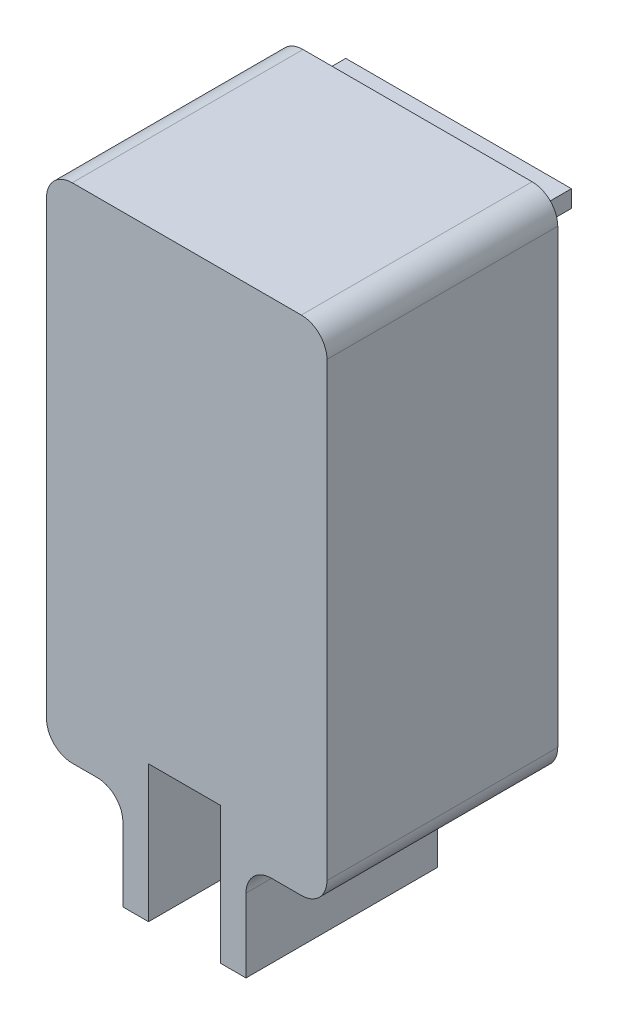
ISO-10303-21;
HEADER;
FILE_DESCRIPTION(('STEP AP214'),'2;1');
FILE_NAME('part.step','',(''),(''),'','','');
FILE_SCHEMA(('AUTOMOTIVE_DESIGN { 1 0 10303 214 1 1 1 1 }'));
ENDSEC;
DATA;
#1=APPLICATION_CONTEXT('core data for automotive mechanical design processes');
#2=APPLICATION_PROTOCOL_DEFINITION('international standard','automotive_design',2000,#1);
#3=PRODUCT_CONTEXT('',#1,'mechanical');
#4=PRODUCT('Part','Part','',(#3));
#5=PRODUCT_RELATED_PRODUCT_CATEGORY('part','',(#4));
#6=PRODUCT_DEFINITION_FORMATION('','',#4);
#7=PRODUCT_DEFINITION_CONTEXT('part definition',#1,'design');
#8=PRODUCT_DEFINITION('design','',#6,#7);
#9=PRODUCT_DEFINITION_SHAPE('','',#8);
#10=(LENGTH_UNIT() NAMED_UNIT(*) SI_UNIT(.MILLI.,.METRE.));
#11=(NAMED_UNIT(*) PLANE_ANGLE_UNIT() SI_UNIT($,.RADIAN.));
#12=(NAMED_UNIT(*) SI_UNIT($,.STERADIAN.) SOLID_ANGLE_UNIT());
#13=UNCERTAINTY_MEASURE_WITH_UNIT(LENGTH_MEASURE(1.E-05),#10,'distance_accuracy_value','');
#14=(GEOMETRIC_REPRESENTATION_CONTEXT(3) GLOBAL_UNCERTAINTY_ASSIGNED_CONTEXT((#13)) GLOBAL_UNIT_ASSIGNED_CONTEXT((#10,
#11,#12)) REPRESENTATION_CONTEXT('',''));
#15=CARTESIAN_POINT('',(0.,0.,0.));
#16=DIRECTION('',(0.,0.,1.));
#17=DIRECTION('',(1.,0.,0.));
#18=AXIS2_PLACEMENT_3D('',#15,#16,#17);
#19=CARTESIAN_POINT('',(7.2,0.,14.));
#20=DIRECTION('',(1.,0.,0.));
#21=DIRECTION('',(0.,0.,-1.));
#22=AXIS2_PLACEMENT_3D('',#19,#20,#21);
#23=PLANE('',#22);
#24=DIRECTION('',(0.,0.,-1.));
#25=VECTOR('',#24,1.);
#26=CARTESIAN_POINT('',(7.2,13.5,14.));
#27=LINE('',#26,#25);
#28=CARTESIAN_POINT('',(7.2,13.5,2.));
#29=VERTEX_POINT('',#28);
#30=CARTESIAN_POINT('',(7.2,13.5,0.));
#31=VERTEX_POINT('',#30);
#32=EDGE_CURVE('E265',#29,#31,#27,.T.);
#33=ORIENTED_EDGE('',*,*,#32,.F.);
#34=DIRECTION('',(0.,-1.,0.));
#35=VECTOR('',#34,1.);
#36=CARTESIAN_POINT('',(7.2,0.,2.));
#37=LINE('',#36,#35);
#38=CARTESIAN_POINT('',(7.2,12.5,2.));
#39=VERTEX_POINT('',#38);
#40=EDGE_CURVE('E247',#29,#39,#37,.T.);
#41=ORIENTED_EDGE('',*,*,#40,.T.);
#42=DIRECTION('',(0.,0.,-1.));
#43=VECTOR('',#42,1.);
#44=CARTESIAN_POINT('',(7.2,12.5,14.));
#45=LINE('',#44,#43);
#46=CARTESIAN_POINT('',(7.2,12.5,0.));
#47=VERTEX_POINT('',#46);
#48=EDGE_CURVE('E273',#39,#47,#45,.T.);
#49=ORIENTED_EDGE('',*,*,#48,.T.);
#50=DIRECTION('',(0.,-1.,0.));
#51=VECTOR('',#50,1.);
#52=CARTESIAN_POINT('',(7.2,0.,0.));
#53=LINE('',#52,#51);
#54=EDGE_CURVE('E272',#31,#47,#53,.T.);
#55=ORIENTED_EDGE('',*,*,#54,.F.);
#56=EDGE_LOOP('',(#33,#41,#49,#55));
#57=FACE_BOUND('',#56,.T.);
#58=ADVANCED_FACE('F43',(#57),#23,.T.);
#59=CARTESIAN_POINT('',(0.,13.5,14.));
#60=DIRECTION('',(0.,-1.,0.));
#61=DIRECTION('',(0.,0.,-1.));
#62=AXIS2_PLACEMENT_3D('',#59,#60,#61);
#63=PLANE('',#62);
#64=DIRECTION('',(1.,0.,0.));
#65=VECTOR('',#64,1.);
#66=CARTESIAN_POINT('',(0.,13.5,2.));
#67=LINE('',#66,#65);
#68=CARTESIAN_POINT('',(-6.,13.5,2.));
#69=VERTEX_POINT('',#68);
#70=EDGE_CURVE('E252',#69,#29,#67,.T.);
#71=ORIENTED_EDGE('',*,*,#70,.T.);
#72=ORIENTED_EDGE('',*,*,#32,.T.);
#73=DIRECTION('',(-1.,0.,0.));
#74=VECTOR('',#73,1.);
#75=CARTESIAN_POINT('',(0.,13.5,0.));
#76=LINE('',#75,#74);
#77=CARTESIAN_POINT('',(-6.,13.5,0.));
#78=VERTEX_POINT('',#77);
#79=EDGE_CURVE('E482',#31,#78,#76,.T.);
#80=ORIENTED_EDGE('',*,*,#79,.T.);
#81=DIRECTION('',(0.,0.,-1.));
#82=VECTOR('',#81,1.);
#83=CARTESIAN_POINT('',(-6.,13.5,14.));
#84=LINE('',#83,#82);
#85=EDGE_CURVE('E267',#69,#78,#84,.T.);
#86=ORIENTED_EDGE('',*,*,#85,.F.);
#87=EDGE_LOOP('',(#71,#72,#80,#86));
#88=FACE_BOUND('',#87,.T.);
#89=ADVANCED_FACE('F263',(#88),#63,.F.);
#90=CARTESIAN_POINT('',(-3.53612903225806,-20.5,0.));
#91=DIRECTION('',(1.,0.,0.));
#92=DIRECTION('',(0.,1.,0.));
#93=AXIS2_PLACEMENT_3D('',#90,#91,#92);
#94=PLANE('',#93);
#95=DIRECTION('',(0.,1.,0.));
#96=VECTOR('',#95,1.);
#97=CARTESIAN_POINT('',(-3.53612903225806,-20.5,15.5));
#98=LINE('',#97,#96);
#99=CARTESIAN_POINT('',(-3.53612903225806,-20.5,15.5));
#100=VERTEX_POINT('',#99);
#101=CARTESIAN_POINT('',(-3.53612903225806,-16.2,15.5));
#102=VERTEX_POINT('',#101);
#103=EDGE_CURVE('E431',#100,#102,#98,.T.);
#104=ORIENTED_EDGE('',*,*,#103,.T.);
#105=DIRECTION('',(0.,0.,1.));
#106=VECTOR('',#105,1.);
#107=CARTESIAN_POINT('',(-3.53612903225806,-16.2,4.30000000000001));
#108=LINE('',#107,#106);
#109=CARTESIAN_POINT('',(-3.53612903225806,-16.2,4.3));
#110=VERTEX_POINT('',#109);
#111=EDGE_CURVE('E327',#102,#110,#108,.F.);
#112=ORIENTED_EDGE('',*,*,#111,.T.);
#113=DIRECTION('',(0.,1.,0.));
#114=VECTOR('',#113,1.);
#115=CARTESIAN_POINT('',(-3.53612903225806,-20.5,4.3));
#116=LINE('',#115,#114);
#117=CARTESIAN_POINT('',(-3.53612903225806,-20.5,4.3));
#118=VERTEX_POINT('',#117);
#119=EDGE_CURVE('E428',#118,#110,#116,.T.);
#120=ORIENTED_EDGE('',*,*,#119,.F.);
#121=DIRECTION('',(0.,0.,-1.));
#122=VECTOR('',#121,1.);
#123=CARTESIAN_POINT('',(-3.53612903225806,-20.5,0.));
#124=LINE('',#123,#122);
#125=EDGE_CURVE('E402',#100,#118,#124,.T.);
#126=ORIENTED_EDGE('',*,*,#125,.F.);
#127=EDGE_LOOP('',(#104,#112,#120,#126));
#128=FACE_BOUND('',#127,.T.);
#129=ADVANCED_FACE('F513',(#128),#94,.F.);
#130=CARTESIAN_POINT('',(3.66387096774194,-20.5,0.));
#131=DIRECTION('',(1.,0.,0.));
#132=DIRECTION('',(0.,1.,0.));
#133=AXIS2_PLACEMENT_3D('',#130,#131,#132);
#134=PLANE('',#133);
#135=DIRECTION('',(0.,1.,0.));
#136=VECTOR('',#135,1.);
#137=CARTESIAN_POINT('',(3.66387096774194,-20.5,4.3));
#138=LINE('',#137,#136);
#139=CARTESIAN_POINT('',(3.66387096774194,-20.5,4.3));
#140=VERTEX_POINT('',#139);
#141=CARTESIAN_POINT('',(3.66387096774194,-16.2,4.3));
#142=VERTEX_POINT('',#141);
#143=EDGE_CURVE('E425',#140,#142,#138,.T.);
#144=ORIENTED_EDGE('',*,*,#143,.T.);
#145=DIRECTION('',(0.,0.,1.));
#146=VECTOR('',#145,1.);
#147=CARTESIAN_POINT('',(3.66387096774194,-16.2,0.));
#148=LINE('',#147,#146);
#149=CARTESIAN_POINT('',(3.66387096774194,-16.2,15.5));
#150=VERTEX_POINT('',#149);
#151=EDGE_CURVE('E318',#142,#150,#148,.T.);
#152=ORIENTED_EDGE('',*,*,#151,.T.);
#153=DIRECTION('',(0.,1.,0.));
#154=VECTOR('',#153,1.);
#155=CARTESIAN_POINT('',(3.66387096774194,-20.5,15.5));
#156=LINE('',#155,#154);
#157=CARTESIAN_POINT('',(3.66387096774194,-20.5,15.5));
#158=VERTEX_POINT('',#157);
#159=EDGE_CURVE('E422',#158,#150,#156,.T.);
#160=ORIENTED_EDGE('',*,*,#159,.F.);
#161=DIRECTION('',(0.,0.,-1.));
#162=VECTOR('',#161,1.);
#163=CARTESIAN_POINT('',(3.66387096774194,-20.5,0.));
#164=LINE('',#163,#162);
#165=EDGE_CURVE('E407',#158,#140,#164,.T.);
#166=ORIENTED_EDGE('',*,*,#165,.T.);
#167=EDGE_LOOP('',(#144,#152,#160,#166));
#168=FACE_BOUND('',#167,.T.);
#169=ADVANCED_FACE('F518',(#168),#134,.T.);
#170=CARTESIAN_POINT('',(0.,12.5,14.));
#171=DIRECTION('',(0.,-1.,0.));
#172=DIRECTION('',(0.,0.,-1.));
#173=AXIS2_PLACEMENT_3D('',#170,#171,#172);
#174=PLANE('',#173);
#175=DIRECTION('',(-1.,0.,0.));
#176=VECTOR('',#175,1.);
#177=CARTESIAN_POINT('',(0.,12.5,14.));
#178=LINE('',#177,#176);
#179=CARTESIAN_POINT('',(4.,12.5,14.));
#180=VERTEX_POINT('',#179);
#181=CARTESIAN_POINT('',(-4.,12.5,14.));
#182=VERTEX_POINT('',#181);
#183=EDGE_CURVE('E475',#180,#182,#178,.T.);
#184=ORIENTED_EDGE('',*,*,#183,.T.);
#185=DIRECTION('',(0.,0.,-1.));
#186=VECTOR('',#185,1.);
#187=CARTESIAN_POINT('',(-4.,12.5,2.));
#188=LINE('',#187,#186);
#189=CARTESIAN_POINT('',(-4.,12.5,2.));
#190=VERTEX_POINT('',#189);
#191=EDGE_CURVE('E302',#182,#190,#188,.T.);
#192=ORIENTED_EDGE('',*,*,#191,.T.);
#193=DIRECTION('',(-1.,0.,0.));
#194=VECTOR('',#193,1.);
#195=CARTESIAN_POINT('',(0.,12.5,2.));
#196=LINE('',#195,#194);
#197=CARTESIAN_POINT('',(-6.,12.5,2.));
#198=VERTEX_POINT('',#197);
#199=EDGE_CURVE('E300',#190,#198,#196,.T.);
#200=ORIENTED_EDGE('',*,*,#199,.T.);
#201=DIRECTION('',(0.,0.,-1.));
#202=VECTOR('',#201,1.);
#203=CARTESIAN_POINT('',(-6.,12.5,14.));
#204=LINE('',#203,#202);
#205=CARTESIAN_POINT('',(-6.,12.5,0.));
#206=VERTEX_POINT('',#205);
#207=EDGE_CURVE('E277',#198,#206,#204,.T.);
#208=ORIENTED_EDGE('',*,*,#207,.T.);
#209=DIRECTION('',(-1.,0.,0.));
#210=VECTOR('',#209,1.);
#211=CARTESIAN_POINT('',(0.,12.5,0.));
#212=LINE('',#211,#210);
#213=EDGE_CURVE('E474',#47,#206,#212,.T.);
#214=ORIENTED_EDGE('',*,*,#213,.F.);
#215=ORIENTED_EDGE('',*,*,#48,.F.);
#216=DIRECTION('',(1.,0.,0.));
#217=VECTOR('',#216,1.);
#218=CARTESIAN_POINT('',(0.,12.5,2.));
#219=LINE('',#218,#217);
#220=CARTESIAN_POINT('',(4.,12.5,2.));
#221=VERTEX_POINT('',#220);
#222=EDGE_CURVE('E255',#221,#39,#219,.T.);
#223=ORIENTED_EDGE('',*,*,#222,.F.);
#224=DIRECTION('',(0.,0.,-1.));
#225=VECTOR('',#224,1.);
#226=CARTESIAN_POINT('',(4.,12.5,14.));
#227=LINE('',#226,#225);
#228=EDGE_CURVE('E298',#221,#180,#227,.F.);
#229=ORIENTED_EDGE('',*,*,#228,.T.);
#230=EDGE_LOOP('',(#184,#192,#200,#208,#214,#215,#223,#229));
#231=FACE_BOUND('',#230,.T.);
#232=ADVANCED_FACE('F488',(#231),#174,.T.);
#233=CARTESIAN_POINT('',(0.,-12.5,14.));
#234=DIRECTION('',(0.,1.,0.));
#235=DIRECTION('',(-1.,0.,0.));
#236=AXIS2_PLACEMENT_3D('',#233,#234,#235);
#237=PLANE('',#236);
#238=DIRECTION('',(1.,0.,0.));
#239=VECTOR('',#238,1.);
#240=CARTESIAN_POINT('',(7.2,-12.5,2.));
#241=LINE('',#240,#239);
#242=CARTESIAN_POINT('',(-4.,-12.5,2.));
#243=VERTEX_POINT('',#242);
#244=CARTESIAN_POINT('',(4.00000000000001,-12.5,2.));
#245=VERTEX_POINT('',#244);
#246=EDGE_CURVE('E391',#243,#245,#241,.T.);
#247=ORIENTED_EDGE('',*,*,#246,.F.);
#248=DIRECTION('',(0.,0.,-1.));
#249=VECTOR('',#248,1.);
#250=CARTESIAN_POINT('',(-3.99999999999999,-12.5,14.));
#251=LINE('',#250,#249);
#252=CARTESIAN_POINT('',(-3.99999999999999,-12.5,14.));
#253=VERTEX_POINT('',#252);
#254=EDGE_CURVE('E288',#243,#253,#251,.F.);
#255=ORIENTED_EDGE('',*,*,#254,.T.);
#256=DIRECTION('',(1.,0.,0.));
#257=VECTOR('',#256,1.);
#258=CARTESIAN_POINT('',(0.,-12.5,14.));
#259=LINE('',#258,#257);
#260=CARTESIAN_POINT('',(-2.03612903225807,-12.5,14.));
#261=VERTEX_POINT('',#260);
#262=EDGE_CURVE('E466',#253,#261,#259,.T.);
#263=ORIENTED_EDGE('',*,*,#262,.T.);
#264=DIRECTION('',(0.,0.,-1.));
#265=VECTOR('',#264,1.);
#266=CARTESIAN_POINT('',(-2.03612903225806,-12.5,0.));
#267=LINE('',#266,#265);
#268=CARTESIAN_POINT('',(-2.03612903225806,-12.5,5.8));
#269=VERTEX_POINT('',#268);
#270=EDGE_CURVE('E448',#261,#269,#267,.T.);
#271=ORIENTED_EDGE('',*,*,#270,.T.);
#272=DIRECTION('',(-1.,0.,0.));
#273=VECTOR('',#272,1.);
#274=CARTESIAN_POINT('',(0.,-12.5,5.8));
#275=LINE('',#274,#273);
#276=CARTESIAN_POINT('',(2.16387096774194,-12.5,5.8));
#277=VERTEX_POINT('',#276);
#278=EDGE_CURVE('E439',#277,#269,#275,.T.);
#279=ORIENTED_EDGE('',*,*,#278,.F.);
#280=DIRECTION('',(0.,0.,-1.));
#281=VECTOR('',#280,1.);
#282=CARTESIAN_POINT('',(2.16387096774194,-12.5,0.));
#283=LINE('',#282,#281);
#284=CARTESIAN_POINT('',(2.16387096774194,-12.5,14.));
#285=VERTEX_POINT('',#284);
#286=EDGE_CURVE('E434',#285,#277,#283,.T.);
#287=ORIENTED_EDGE('',*,*,#286,.F.);
#288=CARTESIAN_POINT('',(4.00000000000001,-12.5,14.));
#289=VERTEX_POINT('',#288);
#290=EDGE_CURVE('E462',#285,#289,#259,.T.);
#291=ORIENTED_EDGE('',*,*,#290,.T.);
#292=DIRECTION('',(0.,0.,-1.));
#293=VECTOR('',#292,1.);
#294=CARTESIAN_POINT('',(4.00000000000001,-12.5,14.));
#295=LINE('',#294,#293);
#296=EDGE_CURVE('E285',#289,#245,#295,.T.);
#297=ORIENTED_EDGE('',*,*,#296,.T.);
#298=EDGE_LOOP('',(#247,#255,#263,#271,#279,#287,#291,#297));
#299=FACE_BOUND('',#298,.T.);
#300=ADVANCED_FACE('F505',(#299),#237,.T.);
#301=CARTESIAN_POINT('',(-6.,0.,14.));
#302=DIRECTION('',(1.,0.,0.));
#303=DIRECTION('',(0.,1.,0.));
#304=AXIS2_PLACEMENT_3D('',#301,#302,#303);
#305=PLANE('',#304);
#306=DIRECTION('',(0.,-1.,0.));
#307=VECTOR('',#306,1.);
#308=CARTESIAN_POINT('',(-6.,0.,2.));
#309=LINE('',#308,#307);
#310=EDGE_CURVE('E469',#69,#198,#309,.T.);
#311=ORIENTED_EDGE('',*,*,#310,.F.);
#312=ORIENTED_EDGE('',*,*,#85,.T.);
#313=DIRECTION('',(0.,-1.,0.));
#314=VECTOR('',#313,1.);
#315=CARTESIAN_POINT('',(-6.,0.,0.));
#316=LINE('',#315,#314);
#317=EDGE_CURVE('E478',#78,#206,#316,.T.);
#318=ORIENTED_EDGE('',*,*,#317,.T.);
#319=ORIENTED_EDGE('',*,*,#207,.F.);
#320=EDGE_LOOP('',(#311,#312,#318,#319));
#321=FACE_BOUND('',#320,.T.);
#322=ADVANCED_FACE('F492',(#321),#305,.F.);
#323=CARTESIAN_POINT('',(0.,0.,0.));
#324=DIRECTION('',(0.,0.,1.));
#325=DIRECTION('',(1.,0.,0.));
#326=AXIS2_PLACEMENT_3D('',#323,#324,#325);
#327=PLANE('',#326);
#328=ORIENTED_EDGE('',*,*,#213,.T.);
#329=ORIENTED_EDGE('',*,*,#317,.F.);
#330=ORIENTED_EDGE('',*,*,#79,.F.);
#331=ORIENTED_EDGE('',*,*,#54,.T.);
#332=EDGE_LOOP('',(#328,#329,#330,#331));
#333=FACE_BOUND('',#332,.T.);
#334=ADVANCED_FACE('F494',(#333),#327,.F.);
#335=CARTESIAN_POINT('',(-6.,0.,41.0185121722126));
#336=DIRECTION('',(1.,0.,0.));
#337=DIRECTION('',(0.,1.,0.));
#338=AXIS2_PLACEMENT_3D('',#335,#336,#337);
#339=PLANE('',#338);
#340=DIRECTION('',(0.,-1.,0.));
#341=VECTOR('',#340,1.);
#342=CARTESIAN_POINT('',(-6.,0.,14.));
#343=LINE('',#342,#341);
#344=CARTESIAN_POINT('',(-6.,10.5,14.));
#345=VERTEX_POINT('',#344);
#346=CARTESIAN_POINT('',(-6.,-10.5,14.));
#347=VERTEX_POINT('',#346);
#348=EDGE_CURVE('E471',#345,#347,#343,.T.);
#349=ORIENTED_EDGE('',*,*,#348,.T.);
#350=DIRECTION('',(0.,0.,-1.));
#351=VECTOR('',#350,1.);
#352=CARTESIAN_POINT('',(-6.,-10.5,2.));
#353=LINE('',#352,#351);
#354=CARTESIAN_POINT('',(-6.,-10.5,2.));
#355=VERTEX_POINT('',#354);
#356=EDGE_CURVE('E282',#347,#355,#353,.T.);
#357=ORIENTED_EDGE('',*,*,#356,.T.);
#358=CARTESIAN_POINT('',(-6.,10.5,2.));
#359=VERTEX_POINT('',#358);
#360=EDGE_CURVE('E468',#359,#355,#309,.T.);
#361=ORIENTED_EDGE('',*,*,#360,.F.);
#362=DIRECTION('',(0.,0.,-1.));
#363=VECTOR('',#362,1.);
#364=CARTESIAN_POINT('',(-6.,10.5,14.));
#365=LINE('',#364,#363);
#366=EDGE_CURVE('E275',#359,#345,#365,.F.);
#367=ORIENTED_EDGE('',*,*,#366,.T.);
#368=EDGE_LOOP('',(#349,#357,#361,#367));
#369=FACE_BOUND('',#368,.T.);
#370=ADVANCED_FACE('F496',(#369),#339,.T.);
#371=CARTESIAN_POINT('',(0.,0.,2.));
#372=DIRECTION('',(0.,0.,1.));
#373=DIRECTION('',(1.,0.,0.));
#374=AXIS2_PLACEMENT_3D('',#371,#372,#373);
#375=PLANE('',#374);
#376=DIRECTION('',(1.,0.,0.));
#377=VECTOR('',#376,1.);
#378=CARTESIAN_POINT('',(0.,14.7,2.));
#379=LINE('',#378,#377);
#380=CARTESIAN_POINT('',(-6.5,14.7,2.));
#381=VERTEX_POINT('',#380);
#382=CARTESIAN_POINT('',(6.9,14.7,2.));
#383=VERTEX_POINT('',#382);
#384=EDGE_CURVE('E387',#381,#383,#379,.T.);
#385=ORIENTED_EDGE('',*,*,#384,.T.);
#386=CARTESIAN_POINT('',(6.9,13.2,2.));
#387=DIRECTION('',(0.,0.,1.));
#388=DIRECTION('',(1.,0.,0.));
#389=AXIS2_PLACEMENT_3D('',#386,#387,#388);
#390=CIRCLE('',#389,1.5);
#391=CARTESIAN_POINT('',(8.4,13.2,2.));
#392=VERTEX_POINT('',#391);
#393=EDGE_CURVE('E365',#383,#392,#390,.F.);
#394=ORIENTED_EDGE('',*,*,#393,.T.);
#395=DIRECTION('',(0.,1.,0.));
#396=VECTOR('',#395,1.);
#397=CARTESIAN_POINT('',(8.4,0.,2.));
#398=LINE('',#397,#396);
#399=CARTESIAN_POINT('',(8.4,-13.2,2.));
#400=VERTEX_POINT('',#399);
#401=EDGE_CURVE('E384',#400,#392,#398,.T.);
#402=ORIENTED_EDGE('',*,*,#401,.F.);
#403=CARTESIAN_POINT('',(6.9,-13.2,2.));
#404=DIRECTION('',(0.,0.,1.));
#405=DIRECTION('',(1.,0.,0.));
#406=AXIS2_PLACEMENT_3D('',#403,#404,#405);
#407=CIRCLE('',#406,1.5);
#408=CARTESIAN_POINT('',(6.9,-14.7,2.));
#409=VERTEX_POINT('',#408);
#410=EDGE_CURVE('E362',#400,#409,#407,.F.);
#411=ORIENTED_EDGE('',*,*,#410,.T.);
#412=DIRECTION('',(1.,0.,0.));
#413=VECTOR('',#412,1.);
#414=CARTESIAN_POINT('',(0.,-14.7,2.));
#415=LINE('',#414,#413);
#416=CARTESIAN_POINT('',(-6.50000000000001,-14.7,2.));
#417=VERTEX_POINT('',#416);
#418=EDGE_CURVE('E259',#417,#409,#415,.T.);
#419=ORIENTED_EDGE('',*,*,#418,.F.);
#420=CARTESIAN_POINT('',(-6.50000000000001,-13.2,2.));
#421=DIRECTION('',(0.,0.,1.));
#422=DIRECTION('',(1.,0.,0.));
#423=AXIS2_PLACEMENT_3D('',#420,#421,#422);
#424=CIRCLE('',#423,1.5);
#425=CARTESIAN_POINT('',(-8.00000000000001,-13.2,2.));
#426=VERTEX_POINT('',#425);
#427=EDGE_CURVE('E58',#417,#426,#424,.F.);
#428=ORIENTED_EDGE('',*,*,#427,.T.);
#429=DIRECTION('',(0.,-1.,0.));
#430=VECTOR('',#429,1.);
#431=CARTESIAN_POINT('',(-8.,14.7,2.));
#432=LINE('',#431,#430);
#433=CARTESIAN_POINT('',(-8.,13.2,2.));
#434=VERTEX_POINT('',#433);
#435=EDGE_CURVE('E581',#434,#426,#432,.T.);
#436=ORIENTED_EDGE('',*,*,#435,.F.);
#437=CARTESIAN_POINT('',(-6.5,13.2,2.));
#438=DIRECTION('',(0.,0.,1.));
#439=DIRECTION('',(1.,0.,0.));
#440=AXIS2_PLACEMENT_3D('',#437,#438,#439);
#441=CIRCLE('',#440,1.5);
#442=EDGE_CURVE('E66',#434,#381,#441,.F.);
#443=ORIENTED_EDGE('',*,*,#442,.T.);
#444=EDGE_LOOP('',(#385,#394,#402,#411,#419,#428,#436,#443));
#445=FACE_BOUND('',#444,.T.);
#446=CARTESIAN_POINT('',(-4.,-10.5,2.));
#447=DIRECTION('',(0.,0.,1.));
#448=DIRECTION('',(1.,0.,0.));
#449=AXIS2_PLACEMENT_3D('',#446,#447,#448);
#450=CIRCLE('',#449,2.);
#451=EDGE_CURVE('E310',#355,#243,#450,.T.);
#452=ORIENTED_EDGE('',*,*,#451,.T.);
#453=ORIENTED_EDGE('',*,*,#246,.T.);
#454=CARTESIAN_POINT('',(4.,-10.5,2.));
#455=DIRECTION('',(0.,0.,1.));
#456=DIRECTION('',(1.,0.,0.));
#457=AXIS2_PLACEMENT_3D('',#454,#455,#456);
#458=CIRCLE('',#457,2.);
#459=CARTESIAN_POINT('',(6.,-10.5,2.));
#460=VERTEX_POINT('',#459);
#461=EDGE_CURVE('E316',#245,#460,#458,.T.);
#462=ORIENTED_EDGE('',*,*,#461,.T.);
#463=DIRECTION('',(0.,-1.,0.));
#464=VECTOR('',#463,1.);
#465=CARTESIAN_POINT('',(6.,0.,2.));
#466=LINE('',#465,#464);
#467=CARTESIAN_POINT('',(6.,10.5,2.));
#468=VERTEX_POINT('',#467);
#469=EDGE_CURVE('E459',#468,#460,#466,.T.);
#470=ORIENTED_EDGE('',*,*,#469,.F.);
#471=CARTESIAN_POINT('',(4.,10.5,2.));
#472=DIRECTION('',(0.,0.,1.));
#473=DIRECTION('',(1.,0.,0.));
#474=AXIS2_PLACEMENT_3D('',#471,#472,#473);
#475=CIRCLE('',#474,2.);
#476=EDGE_CURVE('E314',#468,#221,#475,.T.);
#477=ORIENTED_EDGE('',*,*,#476,.T.);
#478=ORIENTED_EDGE('',*,*,#222,.T.);
#479=ORIENTED_EDGE('',*,*,#40,.F.);
#480=ORIENTED_EDGE('',*,*,#70,.F.);
#481=ORIENTED_EDGE('',*,*,#310,.T.);
#482=ORIENTED_EDGE('',*,*,#199,.F.);
#483=CARTESIAN_POINT('',(-4.,10.5,2.));
#484=DIRECTION('',(0.,0.,1.));
#485=DIRECTION('',(1.,0.,0.));
#486=AXIS2_PLACEMENT_3D('',#483,#484,#485);
#487=CIRCLE('',#486,2.);
#488=EDGE_CURVE('E312',#190,#359,#487,.T.);
#489=ORIENTED_EDGE('',*,*,#488,.T.);
#490=ORIENTED_EDGE('',*,*,#360,.T.);
#491=EDGE_LOOP('',(#452,#453,#462,#470,#477,#478,#479,#480,#481,#482,#489,#490));
#492=FACE_BOUND('',#491,.T.);
#493=ADVANCED_FACE('F250',(#445,#492),#375,.F.);
#494=CARTESIAN_POINT('',(6.,0.,41.0185121722126));
#495=DIRECTION('',(1.,0.,0.));
#496=DIRECTION('',(0.,1.,0.));
#497=AXIS2_PLACEMENT_3D('',#494,#495,#496);
#498=PLANE('',#497);
#499=DIRECTION('',(0.,-1.,0.));
#500=VECTOR('',#499,1.);
#501=CARTESIAN_POINT('',(6.,0.,14.));
#502=LINE('',#501,#500);
#503=CARTESIAN_POINT('',(6.,10.5,14.));
#504=VERTEX_POINT('',#503);
#505=CARTESIAN_POINT('',(6.,-10.5,14.));
#506=VERTEX_POINT('',#505);
#507=EDGE_CURVE('E458',#504,#506,#502,.T.);
#508=ORIENTED_EDGE('',*,*,#507,.F.);
#509=DIRECTION('',(0.,0.,-1.));
#510=VECTOR('',#509,1.);
#511=CARTESIAN_POINT('',(6.,10.5,41.0185121722126));
#512=LINE('',#511,#510);
#513=EDGE_CURVE('E307',#504,#468,#512,.T.);
#514=ORIENTED_EDGE('',*,*,#513,.T.);
#515=ORIENTED_EDGE('',*,*,#469,.T.);
#516=DIRECTION('',(0.,0.,-1.));
#517=VECTOR('',#516,1.);
#518=CARTESIAN_POINT('',(6.,-10.5,41.0185121722126));
#519=LINE('',#518,#517);
#520=EDGE_CURVE('E305',#460,#506,#519,.F.);
#521=ORIENTED_EDGE('',*,*,#520,.T.);
#522=EDGE_LOOP('',(#508,#514,#515,#521));
#523=FACE_BOUND('',#522,.T.);
#524=ADVANCED_FACE('F636',(#523),#498,.F.);
#525=CARTESIAN_POINT('',(0.,0.,14.));
#526=DIRECTION('',(0.,0.,1.));
#527=DIRECTION('',(1.,0.,0.));
#528=AXIS2_PLACEMENT_3D('',#525,#526,#527);
#529=PLANE('',#528);
#530=ORIENTED_EDGE('',*,*,#262,.F.);
#531=CARTESIAN_POINT('',(-4.,-10.5,14.));
#532=DIRECTION('',(0.,0.,1.));
#533=DIRECTION('',(1.,0.,0.));
#534=AXIS2_PLACEMENT_3D('',#531,#532,#533);
#535=CIRCLE('',#534,2.);
#536=EDGE_CURVE('E296',#253,#347,#535,.F.);
#537=ORIENTED_EDGE('',*,*,#536,.T.);
#538=ORIENTED_EDGE('',*,*,#348,.F.);
#539=CARTESIAN_POINT('',(-4.,10.5,14.));
#540=DIRECTION('',(0.,0.,1.));
#541=DIRECTION('',(1.,0.,0.));
#542=AXIS2_PLACEMENT_3D('',#539,#540,#541);
#543=CIRCLE('',#542,2.);
#544=EDGE_CURVE('E294',#345,#182,#543,.F.);
#545=ORIENTED_EDGE('',*,*,#544,.T.);
#546=ORIENTED_EDGE('',*,*,#183,.F.);
#547=CARTESIAN_POINT('',(4.,10.5,14.));
#548=DIRECTION('',(0.,0.,1.));
#549=DIRECTION('',(1.,0.,0.));
#550=AXIS2_PLACEMENT_3D('',#547,#548,#549);
#551=CIRCLE('',#550,2.);
#552=EDGE_CURVE('E292',#180,#504,#551,.F.);
#553=ORIENTED_EDGE('',*,*,#552,.T.);
#554=ORIENTED_EDGE('',*,*,#507,.T.);
#555=CARTESIAN_POINT('',(4.,-10.5,14.));
#556=DIRECTION('',(0.,0.,1.));
#557=DIRECTION('',(1.,0.,0.));
#558=AXIS2_PLACEMENT_3D('',#555,#556,#557);
#559=CIRCLE('',#558,2.);
#560=EDGE_CURVE('E290',#506,#289,#559,.F.);
#561=ORIENTED_EDGE('',*,*,#560,.T.);
#562=ORIENTED_EDGE('',*,*,#290,.F.);
#563=DIRECTION('',(-1.,0.,0.));
#564=VECTOR('',#563,1.);
#565=CARTESIAN_POINT('',(0.,-12.5,14.));
#566=LINE('',#565,#564);
#567=EDGE_CURVE('E455',#285,#261,#566,.T.);
#568=ORIENTED_EDGE('',*,*,#567,.T.);
#569=EDGE_LOOP('',(#530,#537,#538,#545,#546,#553,#554,#561,#562,#568));
#570=FACE_BOUND('',#569,.T.);
#571=ADVANCED_FACE('F633',(#570),#529,.F.);
#572=CARTESIAN_POINT('',(0.,0.,15.5));
#573=DIRECTION('',(0.,0.,1.));
#574=DIRECTION('',(1.,0.,0.));
#575=AXIS2_PLACEMENT_3D('',#572,#573,#574);
#576=PLANE('',#575);
#577=DIRECTION('',(0.,-1.,0.));
#578=VECTOR('',#577,1.);
#579=CARTESIAN_POINT('',(8.4,0.,15.5));
#580=LINE('',#579,#578);
#581=CARTESIAN_POINT('',(8.4,13.2,15.5));
#582=VERTEX_POINT('',#581);
#583=CARTESIAN_POINT('',(8.4,-13.2,15.5));
#584=VERTEX_POINT('',#583);
#585=EDGE_CURVE('E268',#582,#584,#580,.T.);
#586=ORIENTED_EDGE('',*,*,#585,.F.);
#587=CARTESIAN_POINT('',(6.9,13.2,15.5));
#588=DIRECTION('',(0.,0.,1.));
#589=DIRECTION('',(1.,0.,0.));
#590=AXIS2_PLACEMENT_3D('',#587,#588,#589);
#591=CIRCLE('',#590,1.5);
#592=CARTESIAN_POINT('',(6.9,14.7,15.5));
#593=VERTEX_POINT('',#592);
#594=EDGE_CURVE('E355',#582,#593,#591,.T.);
#595=ORIENTED_EDGE('',*,*,#594,.T.);
#596=DIRECTION('',(-1.,0.,0.));
#597=VECTOR('',#596,1.);
#598=CARTESIAN_POINT('',(0.,14.7,15.5));
#599=LINE('',#598,#597);
#600=CARTESIAN_POINT('',(-6.5,14.7,15.5));
#601=VERTEX_POINT('',#600);
#602=EDGE_CURVE('E344',#593,#601,#599,.T.);
#603=ORIENTED_EDGE('',*,*,#602,.T.);
#604=CARTESIAN_POINT('',(-6.5,13.2,15.5));
#605=DIRECTION('',(0.,0.,1.));
#606=DIRECTION('',(1.,0.,0.));
#607=AXIS2_PLACEMENT_3D('',#604,#605,#606);
#608=CIRCLE('',#607,1.5);
#609=CARTESIAN_POINT('',(-8.,13.2,15.5));
#610=VERTEX_POINT('',#609);
#611=EDGE_CURVE('E353',#601,#610,#608,.T.);
#612=ORIENTED_EDGE('',*,*,#611,.T.);
#613=DIRECTION('',(0.,-1.,0.));
#614=VECTOR('',#613,1.);
#615=CARTESIAN_POINT('',(-8.,14.7,15.5));
#616=LINE('',#615,#614);
#617=CARTESIAN_POINT('',(-8.00000000000001,-13.2,15.5));
#618=VERTEX_POINT('',#617);
#619=EDGE_CURVE('E341',#610,#618,#616,.T.);
#620=ORIENTED_EDGE('',*,*,#619,.T.);
#621=CARTESIAN_POINT('',(-6.50000000000001,-13.2,15.5));
#622=DIRECTION('',(0.,0.,1.));
#623=DIRECTION('',(1.,0.,0.));
#624=AXIS2_PLACEMENT_3D('',#621,#622,#623);
#625=CIRCLE('',#624,1.5);
#626=CARTESIAN_POINT('',(-6.50000000000001,-14.7,15.5));
#627=VERTEX_POINT('',#626);
#628=EDGE_CURVE('E349',#618,#627,#625,.T.);
#629=ORIENTED_EDGE('',*,*,#628,.T.);
#630=DIRECTION('',(-1.,0.,0.));
#631=VECTOR('',#630,1.);
#632=CARTESIAN_POINT('',(0.,-14.7,15.5));
#633=LINE('',#632,#631);
#634=CARTESIAN_POINT('',(-5.03612903225806,-14.7,15.5));
#635=VERTEX_POINT('',#634);
#636=EDGE_CURVE('E378',#635,#627,#633,.T.);
#637=ORIENTED_EDGE('',*,*,#636,.F.);
#638=CARTESIAN_POINT('',(-5.03612903225806,-16.2,15.5));
#639=DIRECTION('',(0.,0.,1.));
#640=DIRECTION('',(1.,0.,0.));
#641=AXIS2_PLACEMENT_3D('',#638,#639,#640);
#642=CIRCLE('',#641,1.5);
#643=EDGE_CURVE('E334',#635,#102,#642,.F.);
#644=ORIENTED_EDGE('',*,*,#643,.T.);
#645=ORIENTED_EDGE('',*,*,#103,.F.);
#646=DIRECTION('',(-1.,0.,0.));
#647=VECTOR('',#646,1.);
#648=CARTESIAN_POINT('',(0.,-20.5,15.5));
#649=LINE('',#648,#647);
#650=CARTESIAN_POINT('',(-2.03612903225806,-20.5,15.5));
#651=VERTEX_POINT('',#650);
#652=EDGE_CURVE('E399',#651,#100,#649,.T.);
#653=ORIENTED_EDGE('',*,*,#652,.F.);
#654=DIRECTION('',(0.,-1.,0.));
#655=VECTOR('',#654,1.);
#656=CARTESIAN_POINT('',(-2.03612903225807,-1.92975875393567,15.5));
#657=LINE('',#656,#655);
#658=CARTESIAN_POINT('',(-2.03612903225806,-12.5,15.5));
#659=VERTEX_POINT('',#658);
#660=EDGE_CURVE('E438',#659,#651,#657,.T.);
#661=ORIENTED_EDGE('',*,*,#660,.F.);
#662=DIRECTION('',(-1.,0.,0.));
#663=VECTOR('',#662,1.);
#664=CARTESIAN_POINT('',(0.,-12.5,15.5));
#665=LINE('',#664,#663);
#666=CARTESIAN_POINT('',(2.16387096774194,-12.5,15.5));
#667=VERTEX_POINT('',#666);
#668=EDGE_CURVE('E435',#667,#659,#665,.T.);
#669=ORIENTED_EDGE('',*,*,#668,.F.);
#670=DIRECTION('',(0.,-1.,0.));
#671=VECTOR('',#670,1.);
#672=CARTESIAN_POINT('',(2.16387096774194,-1.92975875393567,15.5));
#673=LINE('',#672,#671);
#674=CARTESIAN_POINT('',(2.16387096774194,-20.5,15.5));
#675=VERTEX_POINT('',#674);
#676=EDGE_CURVE('E451',#667,#675,#673,.T.);
#677=ORIENTED_EDGE('',*,*,#676,.T.);
#678=DIRECTION('',(-1.,0.,0.));
#679=VECTOR('',#678,1.);
#680=CARTESIAN_POINT('',(0.,-20.5,15.5));
#681=LINE('',#680,#679);
#682=EDGE_CURVE('E410',#158,#675,#681,.T.);
#683=ORIENTED_EDGE('',*,*,#682,.F.);
#684=ORIENTED_EDGE('',*,*,#159,.T.);
#685=CARTESIAN_POINT('',(5.16387096774194,-16.2,15.5));
#686=DIRECTION('',(0.,0.,1.));
#687=DIRECTION('',(1.,0.,0.));
#688=AXIS2_PLACEMENT_3D('',#685,#686,#687);
#689=CIRCLE('',#688,1.5);
#690=CARTESIAN_POINT('',(5.16387096774194,-14.7,15.5));
#691=VERTEX_POINT('',#690);
#692=EDGE_CURVE('E331',#150,#691,#689,.F.);
#693=ORIENTED_EDGE('',*,*,#692,.T.);
#694=CARTESIAN_POINT('',(6.9,-14.7,15.5));
#695=VERTEX_POINT('',#694);
#696=EDGE_CURVE('E395',#695,#691,#633,.T.);
#697=ORIENTED_EDGE('',*,*,#696,.F.);
#698=CARTESIAN_POINT('',(6.9,-13.2,15.5));
#699=DIRECTION('',(0.,0.,1.));
#700=DIRECTION('',(1.,0.,0.));
#701=AXIS2_PLACEMENT_3D('',#698,#699,#700);
#702=CIRCLE('',#701,1.5);
#703=EDGE_CURVE('E351',#695,#584,#702,.T.);
#704=ORIENTED_EDGE('',*,*,#703,.T.);
#705=EDGE_LOOP('',(#586,#595,#603,#612,#620,#629,#637,#644,#645,#653,#661,#669,#677,#683,#684,
#693,#697,#704));
#706=FACE_BOUND('',#705,.T.);
#707=ADVANCED_FACE('F565',(#706),#576,.T.);
#708=CARTESIAN_POINT('',(0.,-12.5,14.));
#709=DIRECTION('',(0.,1.,0.));
#710=DIRECTION('',(-1.,0.,0.));
#711=AXIS2_PLACEMENT_3D('',#708,#709,#710);
#712=PLANE('',#711);
#713=EDGE_CURVE('E440',#667,#285,#283,.T.);
#714=ORIENTED_EDGE('',*,*,#713,.F.);
#715=ORIENTED_EDGE('',*,*,#668,.T.);
#716=EDGE_CURVE('E444',#659,#261,#267,.T.);
#717=ORIENTED_EDGE('',*,*,#716,.T.);
#718=ORIENTED_EDGE('',*,*,#567,.F.);
#719=EDGE_LOOP('',(#714,#715,#717,#718));
#720=FACE_BOUND('',#719,.T.);
#721=ADVANCED_FACE('F627',(#720),#712,.F.);
#722=CARTESIAN_POINT('',(-2.03612903225806,-1.92975875393567,0.));
#723=DIRECTION('',(-1.,0.,0.));
#724=DIRECTION('',(0.,-1.,0.));
#725=AXIS2_PLACEMENT_3D('',#722,#723,#724);
#726=PLANE('',#725);
#727=ORIENTED_EDGE('',*,*,#660,.T.);
#728=DIRECTION('',(0.,0.,1.));
#729=VECTOR('',#728,1.);
#730=CARTESIAN_POINT('',(-2.03612903225806,-20.5,0.));
#731=LINE('',#730,#729);
#732=CARTESIAN_POINT('',(-2.03612903225806,-20.5,5.8));
#733=VERTEX_POINT('',#732);
#734=EDGE_CURVE('E419',#733,#651,#731,.T.);
#735=ORIENTED_EDGE('',*,*,#734,.F.);
#736=DIRECTION('',(0.,-1.,0.));
#737=VECTOR('',#736,1.);
#738=CARTESIAN_POINT('',(-2.03612903225806,-1.92975875393567,5.8));
#739=LINE('',#738,#737);
#740=EDGE_CURVE('E447',#269,#733,#739,.T.);
#741=ORIENTED_EDGE('',*,*,#740,.F.);
#742=ORIENTED_EDGE('',*,*,#270,.F.);
#743=ORIENTED_EDGE('',*,*,#716,.F.);
#744=EDGE_LOOP('',(#727,#735,#741,#742,#743));
#745=FACE_BOUND('',#744,.T.);
#746=ADVANCED_FACE('F623',(#745),#726,.F.);
#747=CARTESIAN_POINT('',(0.,-1.92975875393567,5.8));
#748=DIRECTION('',(0.,0.,1.));
#749=DIRECTION('',(1.,0.,0.));
#750=AXIS2_PLACEMENT_3D('',#747,#748,#749);
#751=PLANE('',#750);
#752=ORIENTED_EDGE('',*,*,#278,.T.);
#753=ORIENTED_EDGE('',*,*,#740,.T.);
#754=DIRECTION('',(-1.,0.,0.));
#755=VECTOR('',#754,1.);
#756=CARTESIAN_POINT('',(0.,-20.5,5.8));
#757=LINE('',#756,#755);
#758=CARTESIAN_POINT('',(2.16387096774194,-20.5,5.8));
#759=VERTEX_POINT('',#758);
#760=EDGE_CURVE('E416',#759,#733,#757,.T.);
#761=ORIENTED_EDGE('',*,*,#760,.F.);
#762=DIRECTION('',(0.,-1.,0.));
#763=VECTOR('',#762,1.);
#764=CARTESIAN_POINT('',(2.16387096774194,-1.92975875393567,5.8));
#765=LINE('',#764,#763);
#766=EDGE_CURVE('E449',#277,#759,#765,.T.);
#767=ORIENTED_EDGE('',*,*,#766,.F.);
#768=EDGE_LOOP('',(#752,#753,#761,#767));
#769=FACE_BOUND('',#768,.T.);
#770=ADVANCED_FACE('F619',(#769),#751,.T.);
#771=CARTESIAN_POINT('',(2.16387096774194,-1.92975875393567,0.));
#772=DIRECTION('',(-1.,0.,0.));
#773=DIRECTION('',(0.,-1.,0.));
#774=AXIS2_PLACEMENT_3D('',#771,#772,#773);
#775=PLANE('',#774);
#776=ORIENTED_EDGE('',*,*,#713,.T.);
#777=ORIENTED_EDGE('',*,*,#286,.T.);
#778=ORIENTED_EDGE('',*,*,#766,.T.);
#779=DIRECTION('',(0.,0.,-1.));
#780=VECTOR('',#779,1.);
#781=CARTESIAN_POINT('',(2.16387096774194,-20.5,0.));
#782=LINE('',#781,#780);
#783=EDGE_CURVE('E413',#675,#759,#782,.T.);
#784=ORIENTED_EDGE('',*,*,#783,.F.);
#785=ORIENTED_EDGE('',*,*,#676,.F.);
#786=EDGE_LOOP('',(#776,#777,#778,#784,#785));
#787=FACE_BOUND('',#786,.T.);
#788=ADVANCED_FACE('F612',(#787),#775,.T.);
#789=CARTESIAN_POINT('',(0.,-20.5,4.3));
#790=DIRECTION('',(0.,0.,-1.));
#791=DIRECTION('',(-1.,0.,0.));
#792=AXIS2_PLACEMENT_3D('',#789,#790,#791);
#793=PLANE('',#792);
#794=ORIENTED_EDGE('',*,*,#119,.T.);
#795=DIRECTION('',(1.,0.,0.));
#796=VECTOR('',#795,1.);
#797=CARTESIAN_POINT('',(0.,-16.2,4.3));
#798=LINE('',#797,#796);
#799=EDGE_CURVE('E329',#110,#142,#798,.T.);
#800=ORIENTED_EDGE('',*,*,#799,.T.);
#801=ORIENTED_EDGE('',*,*,#143,.F.);
#802=DIRECTION('',(-1.,0.,0.));
#803=VECTOR('',#802,1.);
#804=CARTESIAN_POINT('',(0.,-20.5,4.3));
#805=LINE('',#804,#803);
#806=EDGE_CURVE('E404',#140,#118,#805,.T.);
#807=ORIENTED_EDGE('',*,*,#806,.T.);
#808=EDGE_LOOP('',(#794,#800,#801,#807));
#809=FACE_BOUND('',#808,.T.);
#810=ADVANCED_FACE('F605',(#809),#793,.T.);
#811=CARTESIAN_POINT('',(0.,-20.5,0.));
#812=DIRECTION('',(0.,-1.,0.));
#813=DIRECTION('',(1.,0.,0.));
#814=AXIS2_PLACEMENT_3D('',#811,#812,#813);
#815=PLANE('',#814);
#816=ORIENTED_EDGE('',*,*,#652,.T.);
#817=ORIENTED_EDGE('',*,*,#125,.T.);
#818=ORIENTED_EDGE('',*,*,#806,.F.);
#819=ORIENTED_EDGE('',*,*,#165,.F.);
#820=ORIENTED_EDGE('',*,*,#682,.T.);
#821=ORIENTED_EDGE('',*,*,#783,.T.);
#822=ORIENTED_EDGE('',*,*,#760,.T.);
#823=ORIENTED_EDGE('',*,*,#734,.T.);
#824=EDGE_LOOP('',(#816,#817,#818,#819,#820,#821,#822,#823));
#825=FACE_BOUND('',#824,.T.);
#826=ADVANCED_FACE('F523',(#825),#815,.T.);
#827=CARTESIAN_POINT('',(-4.,-10.5,41.0185121722126));
#828=DIRECTION('',(0.,0.,1.));
#829=DIRECTION('',(1.,0.,0.));
#830=AXIS2_PLACEMENT_3D('',#827,#828,#829);
#831=CYLINDRICAL_SURFACE('',#830,2.);
#832=ORIENTED_EDGE('',*,*,#536,.F.);
#833=ORIENTED_EDGE('',*,*,#254,.F.);
#834=ORIENTED_EDGE('',*,*,#451,.F.);
#835=ORIENTED_EDGE('',*,*,#356,.F.);
#836=EDGE_LOOP('',(#832,#833,#834,#835));
#837=FACE_BOUND('',#836,.T.);
#838=ADVANCED_FACE('F519',(#837),#831,.F.);
#839=CARTESIAN_POINT('',(-4.,10.5,14.));
#840=DIRECTION('',(0.,0.,1.));
#841=DIRECTION('',(1.,0.,0.));
#842=AXIS2_PLACEMENT_3D('',#839,#840,#841);
#843=CYLINDRICAL_SURFACE('',#842,2.);
#844=ORIENTED_EDGE('',*,*,#544,.F.);
#845=ORIENTED_EDGE('',*,*,#366,.F.);
#846=ORIENTED_EDGE('',*,*,#488,.F.);
#847=ORIENTED_EDGE('',*,*,#191,.F.);
#848=EDGE_LOOP('',(#844,#845,#846,#847));
#849=FACE_BOUND('',#848,.T.);
#850=ADVANCED_FACE('F522',(#849),#843,.F.);
#851=CARTESIAN_POINT('',(4.,10.5,41.0185121722126));
#852=DIRECTION('',(0.,0.,-1.));
#853=DIRECTION('',(-1.,0.,0.));
#854=AXIS2_PLACEMENT_3D('',#851,#852,#853);
#855=CYLINDRICAL_SURFACE('',#854,2.);
#856=ORIENTED_EDGE('',*,*,#552,.F.);
#857=ORIENTED_EDGE('',*,*,#228,.F.);
#858=ORIENTED_EDGE('',*,*,#476,.F.);
#859=ORIENTED_EDGE('',*,*,#513,.F.);
#860=EDGE_LOOP('',(#856,#857,#858,#859));
#861=FACE_BOUND('',#860,.T.);
#862=ADVANCED_FACE('F527',(#861),#855,.F.);
#863=CARTESIAN_POINT('',(4.,-10.5,14.));
#864=DIRECTION('',(0.,0.,-1.));
#865=DIRECTION('',(-1.,0.,0.));
#866=AXIS2_PLACEMENT_3D('',#863,#864,#865);
#867=CYLINDRICAL_SURFACE('',#866,2.);
#868=ORIENTED_EDGE('',*,*,#560,.F.);
#869=ORIENTED_EDGE('',*,*,#520,.F.);
#870=ORIENTED_EDGE('',*,*,#461,.F.);
#871=ORIENTED_EDGE('',*,*,#296,.F.);
#872=EDGE_LOOP('',(#868,#869,#870,#871));
#873=FACE_BOUND('',#872,.T.);
#874=ADVANCED_FACE('F531',(#873),#867,.F.);
#875=CARTESIAN_POINT('',(0.,14.7,-31.8614825428539));
#876=DIRECTION('',(0.,1.,0.));
#877=DIRECTION('',(0.,0.,1.));
#878=AXIS2_PLACEMENT_3D('',#875,#876,#877);
#879=PLANE('',#878);
#880=ORIENTED_EDGE('',*,*,#602,.F.);
#881=DIRECTION('',(0.,0.,1.));
#882=VECTOR('',#881,1.);
#883=CARTESIAN_POINT('',(6.9,14.7,2.));
#884=LINE('',#883,#882);
#885=EDGE_CURVE('E359',#593,#383,#884,.F.);
#886=ORIENTED_EDGE('',*,*,#885,.T.);
#887=ORIENTED_EDGE('',*,*,#384,.F.);
#888=DIRECTION('',(0.,0.,-1.));
#889=VECTOR('',#888,1.);
#890=CARTESIAN_POINT('',(-6.5,14.7,15.5));
#891=LINE('',#890,#889);
#892=EDGE_CURVE('E357',#381,#601,#891,.F.);
#893=ORIENTED_EDGE('',*,*,#892,.T.);
#894=EDGE_LOOP('',(#880,#886,#887,#893));
#895=FACE_BOUND('',#894,.T.);
#896=ADVANCED_FACE('F534',(#895),#879,.T.);
#897=CARTESIAN_POINT('',(8.4,0.,-31.8614825428539));
#898=DIRECTION('',(-1.,0.,0.));
#899=DIRECTION('',(0.,0.,1.));
#900=AXIS2_PLACEMENT_3D('',#897,#898,#899);
#901=PLANE('',#900);
#902=ORIENTED_EDGE('',*,*,#401,.T.);
#903=DIRECTION('',(0.,0.,1.));
#904=VECTOR('',#903,1.);
#905=CARTESIAN_POINT('',(8.4,13.2,15.5));
#906=LINE('',#905,#904);
#907=EDGE_CURVE('E346',#392,#582,#906,.T.);
#908=ORIENTED_EDGE('',*,*,#907,.T.);
#909=ORIENTED_EDGE('',*,*,#585,.T.);
#910=DIRECTION('',(0.,0.,1.));
#911=VECTOR('',#910,1.);
#912=CARTESIAN_POINT('',(8.4,-13.2,-31.8614825428539));
#913=LINE('',#912,#911);
#914=EDGE_CURVE('E336',#584,#400,#913,.F.);
#915=ORIENTED_EDGE('',*,*,#914,.T.);
#916=EDGE_LOOP('',(#902,#908,#909,#915));
#917=FACE_BOUND('',#916,.T.);
#918=ADVANCED_FACE('F592',(#917),#901,.F.);
#919=CARTESIAN_POINT('',(0.,-14.7,-31.8614825428539));
#920=DIRECTION('',(0.,1.,0.));
#921=DIRECTION('',(0.,0.,1.));
#922=AXIS2_PLACEMENT_3D('',#919,#920,#921);
#923=PLANE('',#922);
#924=ORIENTED_EDGE('',*,*,#418,.T.);
#925=DIRECTION('',(0.,0.,1.));
#926=VECTOR('',#925,1.);
#927=CARTESIAN_POINT('',(6.9,-14.7,-31.8614825428539));
#928=LINE('',#927,#926);
#929=EDGE_CURVE('E11',#409,#695,#928,.T.);
#930=ORIENTED_EDGE('',*,*,#929,.T.);
#931=ORIENTED_EDGE('',*,*,#696,.T.);
#932=DIRECTION('',(0.,0.,1.));
#933=VECTOR('',#932,1.);
#934=CARTESIAN_POINT('',(5.16387096774194,-14.7,-31.8614825428539));
#935=LINE('',#934,#933);
#936=CARTESIAN_POINT('',(5.16387096774194,-14.7,2.8));
#937=VERTEX_POINT('',#936);
#938=EDGE_CURVE('E325',#691,#937,#935,.F.);
#939=ORIENTED_EDGE('',*,*,#938,.T.);
#940=DIRECTION('',(1.,0.,0.));
#941=VECTOR('',#940,1.);
#942=CARTESIAN_POINT('',(0.,-14.7,2.8));
#943=LINE('',#942,#941);
#944=CARTESIAN_POINT('',(-5.03612903225806,-14.7,2.8));
#945=VERTEX_POINT('',#944);
#946=EDGE_CURVE('E321',#937,#945,#943,.F.);
#947=ORIENTED_EDGE('',*,*,#946,.T.);
#948=DIRECTION('',(0.,0.,1.));
#949=VECTOR('',#948,1.);
#950=CARTESIAN_POINT('',(-5.03612903225806,-14.7,15.5));
#951=LINE('',#950,#949);
#952=EDGE_CURVE('E323',#945,#635,#951,.T.);
#953=ORIENTED_EDGE('',*,*,#952,.T.);
#954=ORIENTED_EDGE('',*,*,#636,.T.);
#955=DIRECTION('',(0.,0.,-1.));
#956=VECTOR('',#955,1.);
#957=CARTESIAN_POINT('',(-6.50000000000001,-14.7,-31.8614825428539));
#958=LINE('',#957,#956);
#959=EDGE_CURVE('E51',#627,#417,#958,.T.);
#960=ORIENTED_EDGE('',*,*,#959,.T.);
#961=EDGE_LOOP('',(#924,#930,#931,#939,#947,#953,#954,#960));
#962=FACE_BOUND('',#961,.T.);
#963=ADVANCED_FACE('F375',(#962),#923,.F.);
#964=CARTESIAN_POINT('',(-5.03612903225806,-16.2,-31.8614825428539));
#965=DIRECTION('',(0.,0.,-1.));
#966=DIRECTION('',(-1.,0.,0.));
#967=AXIS2_PLACEMENT_3D('',#964,#965,#966);
#968=CYLINDRICAL_SURFACE('',#967,1.5);
#969=ORIENTED_EDGE('',*,*,#643,.F.);
#970=ORIENTED_EDGE('',*,*,#952,.F.);
#971=CARTESIAN_POINT('',(-5.03612903225806,-16.2,2.8));
#972=DIRECTION('',(0.707106781186547,0.,-0.707106781186547));
#973=DIRECTION('',(0.707106781186547,0.,0.707106781186547));
#974=AXIS2_PLACEMENT_3D('',#971,#972,#973);
#975=ELLIPSE('',#974,2.12132034355964,1.5);
#976=EDGE_CURVE('E340',#110,#945,#975,.F.);
#977=ORIENTED_EDGE('',*,*,#976,.F.);
#978=ORIENTED_EDGE('',*,*,#111,.F.);
#979=EDGE_LOOP('',(#969,#970,#977,#978));
#980=FACE_BOUND('',#979,.T.);
#981=ADVANCED_FACE('F544',(#980),#968,.F.);
#982=CARTESIAN_POINT('',(0.,-16.2,2.8));
#983=DIRECTION('',(1.,0.,0.));
#984=DIRECTION('',(0.,0.,-1.));
#985=AXIS2_PLACEMENT_3D('',#982,#983,#984);
#986=CYLINDRICAL_SURFACE('',#985,1.5);
#987=ORIENTED_EDGE('',*,*,#976,.T.);
#988=ORIENTED_EDGE('',*,*,#946,.F.);
#989=CARTESIAN_POINT('',(5.16387096774194,-16.2,2.8));
#990=DIRECTION('',(0.707106781186547,0.,0.707106781186547));
#991=DIRECTION('',(0.707106781186547,0.,-0.707106781186547));
#992=AXIS2_PLACEMENT_3D('',#989,#990,#991);
#993=ELLIPSE('',#992,2.12132034355964,1.5);
#994=EDGE_CURVE('E337',#142,#937,#993,.F.);
#995=ORIENTED_EDGE('',*,*,#994,.F.);
#996=ORIENTED_EDGE('',*,*,#799,.F.);
#997=EDGE_LOOP('',(#987,#988,#995,#996));
#998=FACE_BOUND('',#997,.T.);
#999=ADVANCED_FACE('F540',(#998),#986,.F.);
#1000=CARTESIAN_POINT('',(5.16387096774194,-16.2,0.));
#1001=DIRECTION('',(0.,0.,1.));
#1002=DIRECTION('',(1.,0.,0.));
#1003=AXIS2_PLACEMENT_3D('',#1000,#1001,#1002);
#1004=CYLINDRICAL_SURFACE('',#1003,1.5);
#1005=ORIENTED_EDGE('',*,*,#994,.T.);
#1006=ORIENTED_EDGE('',*,*,#938,.F.);
#1007=ORIENTED_EDGE('',*,*,#692,.F.);
#1008=ORIENTED_EDGE('',*,*,#151,.F.);
#1009=EDGE_LOOP('',(#1005,#1006,#1007,#1008));
#1010=FACE_BOUND('',#1009,.T.);
#1011=ADVANCED_FACE('F536',(#1010),#1004,.F.);
#1012=CARTESIAN_POINT('',(-8.,14.7,44.9027209625232));
#1013=DIRECTION('',(1.,0.,0.));
#1014=DIRECTION('',(0.,1.,0.));
#1015=AXIS2_PLACEMENT_3D('',#1012,#1013,#1014);
#1016=PLANE('',#1015);
#1017=ORIENTED_EDGE('',*,*,#619,.F.);
#1018=DIRECTION('',(0.,0.,-1.));
#1019=VECTOR('',#1018,1.);
#1020=CARTESIAN_POINT('',(-8.,13.2,2.));
#1021=LINE('',#1020,#1019);
#1022=EDGE_CURVE('E369',#610,#434,#1021,.T.);
#1023=ORIENTED_EDGE('',*,*,#1022,.T.);
#1024=ORIENTED_EDGE('',*,*,#435,.T.);
#1025=DIRECTION('',(0.,0.,-1.));
#1026=VECTOR('',#1025,1.);
#1027=CARTESIAN_POINT('',(-8.00000000000001,-13.2,44.9027209625232));
#1028=LINE('',#1027,#1026);
#1029=EDGE_CURVE('E367',#426,#618,#1028,.F.);
#1030=ORIENTED_EDGE('',*,*,#1029,.T.);
#1031=EDGE_LOOP('',(#1017,#1023,#1024,#1030));
#1032=FACE_BOUND('',#1031,.T.);
#1033=ADVANCED_FACE('F539',(#1032),#1016,.F.);
#1034=CARTESIAN_POINT('',(6.9,13.2,-31.8614825428539));
#1035=DIRECTION('',(0.,0.,-1.));
#1036=DIRECTION('',(-1.,0.,0.));
#1037=AXIS2_PLACEMENT_3D('',#1034,#1035,#1036);
#1038=CYLINDRICAL_SURFACE('',#1037,1.5);
#1039=ORIENTED_EDGE('',*,*,#393,.F.);
#1040=ORIENTED_EDGE('',*,*,#885,.F.);
#1041=ORIENTED_EDGE('',*,*,#594,.F.);
#1042=ORIENTED_EDGE('',*,*,#907,.F.);
#1043=EDGE_LOOP('',(#1039,#1040,#1041,#1042));
#1044=FACE_BOUND('',#1043,.T.);
#1045=ADVANCED_FACE('F549',(#1044),#1038,.T.);
#1046=CARTESIAN_POINT('',(-6.5,13.2,44.9027209625232));
#1047=DIRECTION('',(0.,0.,1.));
#1048=DIRECTION('',(1.,0.,0.));
#1049=AXIS2_PLACEMENT_3D('',#1046,#1047,#1048);
#1050=CYLINDRICAL_SURFACE('',#1049,1.5);
#1051=ORIENTED_EDGE('',*,*,#611,.F.);
#1052=ORIENTED_EDGE('',*,*,#892,.F.);
#1053=ORIENTED_EDGE('',*,*,#442,.F.);
#1054=ORIENTED_EDGE('',*,*,#1022,.F.);
#1055=EDGE_LOOP('',(#1051,#1052,#1053,#1054));
#1056=FACE_BOUND('',#1055,.T.);
#1057=ADVANCED_FACE('F552',(#1056),#1050,.T.);
#1058=CARTESIAN_POINT('',(6.9,-13.2,-31.8614825428539));
#1059=DIRECTION('',(0.,0.,1.));
#1060=DIRECTION('',(1.,0.,0.));
#1061=AXIS2_PLACEMENT_3D('',#1058,#1059,#1060);
#1062=CYLINDRICAL_SURFACE('',#1061,1.5);
#1063=ORIENTED_EDGE('',*,*,#410,.F.);
#1064=ORIENTED_EDGE('',*,*,#914,.F.);
#1065=ORIENTED_EDGE('',*,*,#703,.F.);
#1066=ORIENTED_EDGE('',*,*,#929,.F.);
#1067=EDGE_LOOP('',(#1063,#1064,#1065,#1066));
#1068=FACE_BOUND('',#1067,.T.);
#1069=ADVANCED_FACE('F555',(#1068),#1062,.T.);
#1070=CARTESIAN_POINT('',(-6.50000000000001,-13.2,-31.8614825428539));
#1071=DIRECTION('',(0.,0.,-1.));
#1072=DIRECTION('',(-1.,0.,0.));
#1073=AXIS2_PLACEMENT_3D('',#1070,#1071,#1072);
#1074=CYLINDRICAL_SURFACE('',#1073,1.5);
#1075=ORIENTED_EDGE('',*,*,#628,.F.);
#1076=ORIENTED_EDGE('',*,*,#1029,.F.);
#1077=ORIENTED_EDGE('',*,*,#427,.F.);
#1078=ORIENTED_EDGE('',*,*,#959,.F.);
#1079=EDGE_LOOP('',(#1075,#1076,#1077,#1078));
#1080=FACE_BOUND('',#1079,.T.);
#1081=ADVANCED_FACE('F45',(#1080),#1074,.T.);
#1082=CLOSED_SHELL('',(#58,#89,#129,#169,#232,#300,#322,#334,#370,#493,#524,#571,#707,#721,#746,
#770,#788,#810,#826,#838,#850,#862,#874,#896,#918,#963,#981,#999,#1011,#1033,#1045,#1057,#1069,#1081));
#1083=MANIFOLD_SOLID_BREP('B2',#1082);
#1084=ADVANCED_BREP_SHAPE_REPRESENTATION('',(#18,#1083),#14);
#1085=SHAPE_DEFINITION_REPRESENTATION(#9,#1084);
ENDSEC;
END-ISO-10303-21;
